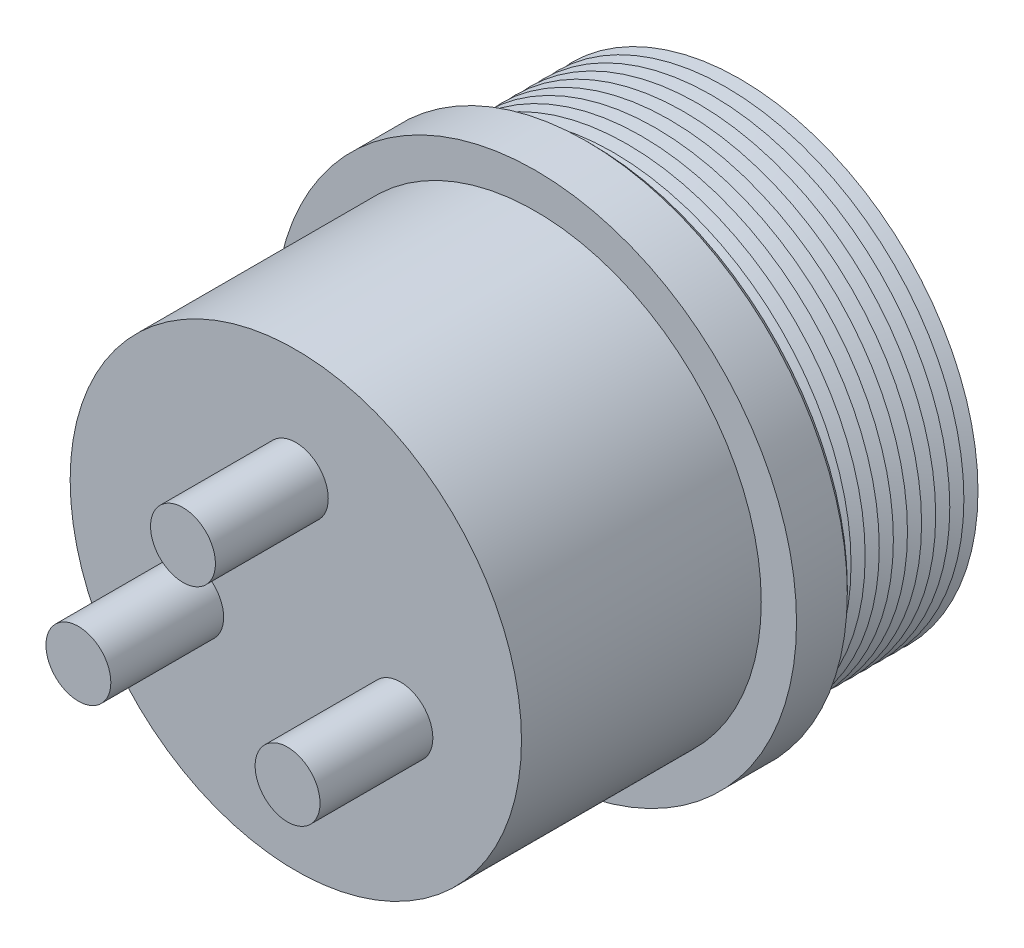
ISO-10303-21;
HEADER;
FILE_DESCRIPTION(('STEP AP214'),'2;1');
FILE_NAME('part.step','',(''),(''),'','','');
FILE_SCHEMA(('AUTOMOTIVE_DESIGN { 1 0 10303 214 1 1 1 1 }'));
ENDSEC;
DATA;
#1=APPLICATION_CONTEXT('core data for automotive mechanical design processes');
#2=APPLICATION_PROTOCOL_DEFINITION('international standard','automotive_design',2000,#1);
#3=PRODUCT_CONTEXT('',#1,'mechanical');
#4=PRODUCT('Part','Part','',(#3));
#5=PRODUCT_RELATED_PRODUCT_CATEGORY('part','',(#4));
#6=PRODUCT_DEFINITION_FORMATION('','',#4);
#7=PRODUCT_DEFINITION_CONTEXT('part definition',#1,'design');
#8=PRODUCT_DEFINITION('design','',#6,#7);
#9=PRODUCT_DEFINITION_SHAPE('','',#8);
#10=(LENGTH_UNIT() NAMED_UNIT(*) SI_UNIT(.MILLI.,.METRE.));
#11=(NAMED_UNIT(*) PLANE_ANGLE_UNIT() SI_UNIT($,.RADIAN.));
#12=(NAMED_UNIT(*) SI_UNIT($,.STERADIAN.) SOLID_ANGLE_UNIT());
#13=UNCERTAINTY_MEASURE_WITH_UNIT(LENGTH_MEASURE(1.E-05),#10,'distance_accuracy_value','');
#14=(GEOMETRIC_REPRESENTATION_CONTEXT(3) GLOBAL_UNCERTAINTY_ASSIGNED_CONTEXT((#13)) GLOBAL_UNIT_ASSIGNED_CONTEXT((#10,
#11,#12)) REPRESENTATION_CONTEXT('',''));
#15=CARTESIAN_POINT('',(0.,0.,0.));
#16=DIRECTION('',(0.,0.,1.));
#17=DIRECTION('',(1.,0.,0.));
#18=AXIS2_PLACEMENT_3D('',#15,#16,#17);
#19=CARTESIAN_POINT('',(0.,0.,0.75));
#20=DIRECTION('',(0.,0.,1.));
#21=DIRECTION('',(1.,0.,0.));
#22=AXIS2_PLACEMENT_3D('',#19,#20,#21);
#23=CONICAL_SURFACE('',#22,8.43301270189222,1.0471975511966);
#24=CARTESIAN_POINT('',(0.,0.,0.5));
#25=DIRECTION('',(0.,0.,-1.));
#26=DIRECTION('',(-1.,0.,0.));
#27=AXIS2_PLACEMENT_3D('',#24,#25,#26);
#28=CIRCLE('',#27,8.);
#29=CARTESIAN_POINT('',(-8.,0.,0.5));
#30=VERTEX_POINT('',#29);
#31=EDGE_CURVE('E112',#30,#30,#28,.T.);
#32=ORIENTED_EDGE('',*,*,#31,.F.);
#33=EDGE_LOOP('',(#32));
#34=FACE_BOUND('',#33,.T.);
#35=CARTESIAN_POINT('',(0.,0.,0.75));
#36=DIRECTION('',(0.,0.,-1.));
#37=DIRECTION('',(-1.,0.,0.));
#38=AXIS2_PLACEMENT_3D('',#35,#36,#37);
#39=CIRCLE('',#38,8.43301270189222);
#40=CARTESIAN_POINT('',(-8.43301270189222,0.,0.75));
#41=VERTEX_POINT('',#40);
#42=EDGE_CURVE('E115',#41,#41,#39,.T.);
#43=ORIENTED_EDGE('',*,*,#42,.T.);
#44=EDGE_LOOP('',(#43));
#45=FACE_BOUND('',#44,.T.);
#46=ADVANCED_FACE('F32',(#34,#45),#23,.T.);
#47=CARTESIAN_POINT('',(0.,0.,1.));
#48=DIRECTION('',(0.,0.,-1.));
#49=DIRECTION('',(-1.,0.,0.));
#50=AXIS2_PLACEMENT_3D('',#47,#48,#49);
#51=CONICAL_SURFACE('',#50,8.,1.0471975511966);
#52=ORIENTED_EDGE('',*,*,#42,.F.);
#53=EDGE_LOOP('',(#52));
#54=FACE_BOUND('',#53,.T.);
#55=CARTESIAN_POINT('',(0.,0.,1.));
#56=DIRECTION('',(0.,0.,-1.));
#57=DIRECTION('',(-1.,0.,0.));
#58=AXIS2_PLACEMENT_3D('',#55,#56,#57);
#59=CIRCLE('',#58,8.);
#60=CARTESIAN_POINT('',(-8.,0.,1.));
#61=VERTEX_POINT('',#60);
#62=EDGE_CURVE('E118',#61,#61,#59,.T.);
#63=ORIENTED_EDGE('',*,*,#62,.T.);
#64=EDGE_LOOP('',(#63));
#65=FACE_BOUND('',#64,.T.);
#66=ADVANCED_FACE('F192',(#54,#65),#51,.T.);
#67=CARTESIAN_POINT('',(0.,4.,0.));
#68=DIRECTION('',(0.,0.,1.));
#69=DIRECTION('',(1.,0.,0.));
#70=AXIS2_PLACEMENT_3D('',#67,#68,#69);
#71=PLANE('',#70);
#72=CARTESIAN_POINT('',(0.,4.,0.));
#73=DIRECTION('',(0.,0.,1.));
#74=DIRECTION('',(1.,0.,0.));
#75=AXIS2_PLACEMENT_3D('',#72,#73,#74);
#76=CIRCLE('',#75,0.15);
#77=CARTESIAN_POINT('',(0.15,4.,0.));
#78=VERTEX_POINT('',#77);
#79=EDGE_CURVE('E43',#78,#78,#76,.F.);
#80=ORIENTED_EDGE('',*,*,#79,.T.);
#81=EDGE_LOOP('',(#80));
#82=FACE_BOUND('',#81,.T.);
#83=ADVANCED_FACE('F198',(#82),#71,.F.);
#84=CARTESIAN_POINT('',(3.70809924354783,-1.5,0.));
#85=DIRECTION('',(0.,0.,1.));
#86=DIRECTION('',(1.,0.,0.));
#87=AXIS2_PLACEMENT_3D('',#84,#85,#86);
#88=PLANE('',#87);
#89=CARTESIAN_POINT('',(3.70809924354783,-1.5,0.));
#90=DIRECTION('',(0.,0.,1.));
#91=DIRECTION('',(1.,0.,0.));
#92=AXIS2_PLACEMENT_3D('',#89,#90,#91);
#93=CIRCLE('',#92,0.15);
#94=CARTESIAN_POINT('',(3.85809924354783,-1.5,0.));
#95=VERTEX_POINT('',#94);
#96=EDGE_CURVE('E52',#95,#95,#93,.F.);
#97=ORIENTED_EDGE('',*,*,#96,.T.);
#98=EDGE_LOOP('',(#97));
#99=FACE_BOUND('',#98,.T.);
#100=ADVANCED_FACE('F225',(#99),#88,.F.);
#101=CARTESIAN_POINT('',(-3.70809924354783,-1.5,0.));
#102=DIRECTION('',(0.,0.,1.));
#103=DIRECTION('',(1.,0.,0.));
#104=AXIS2_PLACEMENT_3D('',#101,#102,#103);
#105=PLANE('',#104);
#106=CARTESIAN_POINT('',(-3.70809924354783,-1.5,0.));
#107=DIRECTION('',(0.,0.,1.));
#108=DIRECTION('',(1.,0.,0.));
#109=AXIS2_PLACEMENT_3D('',#106,#107,#108);
#110=CIRCLE('',#109,0.15);
#111=CARTESIAN_POINT('',(-3.55809924354783,-1.5,0.));
#112=VERTEX_POINT('',#111);
#113=EDGE_CURVE('E58',#112,#112,#110,.F.);
#114=ORIENTED_EDGE('',*,*,#113,.T.);
#115=EDGE_LOOP('',(#114));
#116=FACE_BOUND('',#115,.T.);
#117=ADVANCED_FACE('F221',(#116),#105,.F.);
#118=CARTESIAN_POINT('',(0.,4.,1.));
#119=DIRECTION('',(0.,0.,1.));
#120=DIRECTION('',(1.,0.,0.));
#121=AXIS2_PLACEMENT_3D('',#118,#119,#120);
#122=DEGENERATE_TOROIDAL_SURFACE('',#121,0.15,1.,.T.);
#123=ORIENTED_EDGE('',*,*,#79,.F.);
#124=EDGE_LOOP('',(#123));
#125=FACE_BOUND('',#124,.T.);
#126=CARTESIAN_POINT('',(0.,4.,1.));
#127=DIRECTION('',(0.,0.,1.));
#128=DIRECTION('',(1.,0.,0.));
#129=AXIS2_PLACEMENT_3D('',#126,#127,#128);
#130=CIRCLE('',#129,1.15);
#131=CARTESIAN_POINT('',(1.15,4.,1.));
#132=VERTEX_POINT('',#131);
#133=EDGE_CURVE('E47',#132,#132,#130,.T.);
#134=ORIENTED_EDGE('',*,*,#133,.F.);
#135=EDGE_LOOP('',(#134));
#136=FACE_BOUND('',#135,.T.);
#137=ADVANCED_FACE('F224',(#125,#136),#122,.T.);
#138=CARTESIAN_POINT('',(3.70809924354783,-1.5,1.));
#139=DIRECTION('',(0.,0.,1.));
#140=DIRECTION('',(1.,0.,0.));
#141=AXIS2_PLACEMENT_3D('',#138,#139,#140);
#142=DEGENERATE_TOROIDAL_SURFACE('',#141,0.15,1.,.T.);
#143=ORIENTED_EDGE('',*,*,#96,.F.);
#144=EDGE_LOOP('',(#143));
#145=FACE_BOUND('',#144,.T.);
#146=CARTESIAN_POINT('',(3.70809924354783,-1.5,1.));
#147=DIRECTION('',(0.,0.,1.));
#148=DIRECTION('',(1.,0.,0.));
#149=AXIS2_PLACEMENT_3D('',#146,#147,#148);
#150=CIRCLE('',#149,1.15);
#151=CARTESIAN_POINT('',(4.85809924354783,-1.5,1.));
#152=VERTEX_POINT('',#151);
#153=EDGE_CURVE('E55',#152,#152,#150,.T.);
#154=ORIENTED_EDGE('',*,*,#153,.F.);
#155=EDGE_LOOP('',(#154));
#156=FACE_BOUND('',#155,.T.);
#157=ADVANCED_FACE('F286',(#145,#156),#142,.T.);
#158=CARTESIAN_POINT('',(-3.70809924354783,-1.5,1.));
#159=DIRECTION('',(0.,0.,1.));
#160=DIRECTION('',(1.,0.,0.));
#161=AXIS2_PLACEMENT_3D('',#158,#159,#160);
#162=DEGENERATE_TOROIDAL_SURFACE('',#161,0.15,1.,.T.);
#163=ORIENTED_EDGE('',*,*,#113,.F.);
#164=EDGE_LOOP('',(#163));
#165=FACE_BOUND('',#164,.T.);
#166=CARTESIAN_POINT('',(-3.70809924354783,-1.5,1.));
#167=DIRECTION('',(0.,0.,1.));
#168=DIRECTION('',(1.,0.,0.));
#169=AXIS2_PLACEMENT_3D('',#166,#167,#168);
#170=CIRCLE('',#169,1.15);
#171=CARTESIAN_POINT('',(-2.55809924354783,-1.5,1.));
#172=VERTEX_POINT('',#171);
#173=EDGE_CURVE('E61',#172,#172,#170,.T.);
#174=ORIENTED_EDGE('',*,*,#173,.F.);
#175=EDGE_LOOP('',(#174));
#176=FACE_BOUND('',#175,.T.);
#177=ADVANCED_FACE('F254',(#165,#176),#162,.T.);
#178=CARTESIAN_POINT('',(0.,4.,0.));
#179=DIRECTION('',(0.,0.,1.));
#180=DIRECTION('',(1.,0.,0.));
#181=AXIS2_PLACEMENT_3D('',#178,#179,#180);
#182=CYLINDRICAL_SURFACE('',#181,1.15);
#183=ORIENTED_EDGE('',*,*,#133,.T.);
#184=EDGE_LOOP('',(#183));
#185=FACE_BOUND('',#184,.T.);
#186=CARTESIAN_POINT('',(0.,4.,10.));
#187=DIRECTION('',(0.,0.,-1.));
#188=DIRECTION('',(-1.,0.,0.));
#189=AXIS2_PLACEMENT_3D('',#186,#187,#188);
#190=CIRCLE('',#189,1.15);
#191=CARTESIAN_POINT('',(-1.15,4.,10.));
#192=VERTEX_POINT('',#191);
#193=EDGE_CURVE('E73',#192,#192,#190,.T.);
#194=ORIENTED_EDGE('',*,*,#193,.T.);
#195=EDGE_LOOP('',(#194));
#196=FACE_BOUND('',#195,.T.);
#197=ADVANCED_FACE('F243',(#185,#196),#182,.T.);
#198=CARTESIAN_POINT('',(3.70809924354783,-1.5,0.));
#199=DIRECTION('',(0.,0.,1.));
#200=DIRECTION('',(1.,0.,0.));
#201=AXIS2_PLACEMENT_3D('',#198,#199,#200);
#202=CYLINDRICAL_SURFACE('',#201,1.15);
#203=ORIENTED_EDGE('',*,*,#153,.T.);
#204=EDGE_LOOP('',(#203));
#205=FACE_BOUND('',#204,.T.);
#206=CARTESIAN_POINT('',(3.70809924354783,-1.5,10.));
#207=DIRECTION('',(0.,0.,-1.));
#208=DIRECTION('',(-1.,0.,0.));
#209=AXIS2_PLACEMENT_3D('',#206,#207,#208);
#210=CIRCLE('',#209,1.15);
#211=CARTESIAN_POINT('',(2.55809924354783,-1.5,10.));
#212=VERTEX_POINT('',#211);
#213=EDGE_CURVE('E69',#212,#212,#210,.T.);
#214=ORIENTED_EDGE('',*,*,#213,.T.);
#215=EDGE_LOOP('',(#214));
#216=FACE_BOUND('',#215,.T.);
#217=ADVANCED_FACE('F231',(#205,#216),#202,.T.);
#218=CARTESIAN_POINT('',(-3.70809924354783,-1.5,0.));
#219=DIRECTION('',(0.,0.,1.));
#220=DIRECTION('',(1.,0.,0.));
#221=AXIS2_PLACEMENT_3D('',#218,#219,#220);
#222=CYLINDRICAL_SURFACE('',#221,1.15);
#223=ORIENTED_EDGE('',*,*,#173,.T.);
#224=EDGE_LOOP('',(#223));
#225=FACE_BOUND('',#224,.T.);
#226=CARTESIAN_POINT('',(-3.70809924354783,-1.5,10.));
#227=DIRECTION('',(0.,0.,-1.));
#228=DIRECTION('',(-1.,0.,0.));
#229=AXIS2_PLACEMENT_3D('',#226,#227,#228);
#230=CIRCLE('',#229,1.15);
#231=CARTESIAN_POINT('',(-4.85809924354783,-1.5,10.));
#232=VERTEX_POINT('',#231);
#233=EDGE_CURVE('E65',#232,#232,#230,.T.);
#234=ORIENTED_EDGE('',*,*,#233,.T.);
#235=EDGE_LOOP('',(#234));
#236=FACE_BOUND('',#235,.T.);
#237=ADVANCED_FACE('F227',(#225,#236),#222,.T.);
#238=CARTESIAN_POINT('',(0.,0.,10.));
#239=DIRECTION('',(0.,0.,-1.));
#240=DIRECTION('',(-1.,0.,0.));
#241=AXIS2_PLACEMENT_3D('',#238,#239,#240);
#242=PLANE('',#241);
#243=ORIENTED_EDGE('',*,*,#233,.F.);
#244=EDGE_LOOP('',(#243));
#245=FACE_BOUND('',#244,.T.);
#246=ORIENTED_EDGE('',*,*,#213,.F.);
#247=EDGE_LOOP('',(#246));
#248=FACE_BOUND('',#247,.T.);
#249=ORIENTED_EDGE('',*,*,#193,.F.);
#250=EDGE_LOOP('',(#249));
#251=FACE_BOUND('',#250,.T.);
#252=CARTESIAN_POINT('',(0.,0.,10.));
#253=DIRECTION('',(0.,0.,-1.));
#254=DIRECTION('',(-1.,0.,0.));
#255=AXIS2_PLACEMENT_3D('',#252,#253,#254);
#256=CIRCLE('',#255,7.00000000000001);
#257=CARTESIAN_POINT('',(-7.00000000000001,0.,10.));
#258=VERTEX_POINT('',#257);
#259=EDGE_CURVE('E88',#258,#258,#256,.T.);
#260=ORIENTED_EDGE('',*,*,#259,.T.);
#261=EDGE_LOOP('',(#260));
#262=FACE_BOUND('',#261,.T.);
#263=ADVANCED_FACE('F230',(#245,#248,#251,#262),#242,.T.);
#264=CARTESIAN_POINT('',(0.,0.,10.));
#265=DIRECTION('',(0.,0.,-1.));
#266=DIRECTION('',(-1.,0.,0.));
#267=AXIS2_PLACEMENT_3D('',#264,#265,#266);
#268=CYLINDRICAL_SURFACE('',#267,7.00000000000001);
#269=ORIENTED_EDGE('',*,*,#259,.F.);
#270=EDGE_LOOP('',(#269));
#271=FACE_BOUND('',#270,.T.);
#272=CARTESIAN_POINT('',(0.,0.,0.));
#273=DIRECTION('',(0.,0.,-1.));
#274=DIRECTION('',(-1.,0.,0.));
#275=AXIS2_PLACEMENT_3D('',#272,#273,#274);
#276=CIRCLE('',#275,7.00000000000001);
#277=CARTESIAN_POINT('',(-7.00000000000001,0.,0.));
#278=VERTEX_POINT('',#277);
#279=EDGE_CURVE('E89',#278,#278,#276,.T.);
#280=ORIENTED_EDGE('',*,*,#279,.T.);
#281=EDGE_LOOP('',(#280));
#282=FACE_BOUND('',#281,.T.);
#283=ADVANCED_FACE('F257',(#271,#282),#268,.F.);
#284=CARTESIAN_POINT('',(0.,0.,0.));
#285=DIRECTION('',(0.,0.,1.));
#286=DIRECTION('',(1.,0.,0.));
#287=AXIS2_PLACEMENT_3D('',#284,#285,#286);
#288=PLANE('',#287);
#289=ORIENTED_EDGE('',*,*,#279,.F.);
#290=EDGE_LOOP('',(#289));
#291=FACE_BOUND('',#290,.T.);
#292=CARTESIAN_POINT('',(0.,0.,0.));
#293=DIRECTION('',(0.,0.,1.));
#294=DIRECTION('',(1.,0.,0.));
#295=AXIS2_PLACEMENT_3D('',#292,#293,#294);
#296=CIRCLE('',#295,8.);
#297=CARTESIAN_POINT('',(8.,0.,0.));
#298=VERTEX_POINT('',#297);
#299=EDGE_CURVE('E77',#298,#298,#296,.T.);
#300=ORIENTED_EDGE('',*,*,#299,.F.);
#301=EDGE_LOOP('',(#300));
#302=FACE_BOUND('',#301,.T.);
#303=ADVANCED_FACE('F213',(#291,#302),#288,.F.);
#304=CARTESIAN_POINT('',(0.,0.,0.25));
#305=DIRECTION('',(0.,0.,1.));
#306=DIRECTION('',(1.,0.,0.));
#307=AXIS2_PLACEMENT_3D('',#304,#305,#306);
#308=CONICAL_SURFACE('',#307,8.43301270189222,1.0471975511966);
#309=ORIENTED_EDGE('',*,*,#299,.T.);
#310=EDGE_LOOP('',(#309));
#311=FACE_BOUND('',#310,.T.);
#312=CARTESIAN_POINT('',(0.,0.,0.25));
#313=DIRECTION('',(0.,0.,-1.));
#314=DIRECTION('',(-1.,0.,0.));
#315=AXIS2_PLACEMENT_3D('',#312,#313,#314);
#316=CIRCLE('',#315,8.43301270189222);
#317=CARTESIAN_POINT('',(-8.43301270189222,0.,0.25));
#318=VERTEX_POINT('',#317);
#319=EDGE_CURVE('E109',#318,#318,#316,.T.);
#320=ORIENTED_EDGE('',*,*,#319,.T.);
#321=EDGE_LOOP('',(#320));
#322=FACE_BOUND('',#321,.T.);
#323=ADVANCED_FACE('F209',(#311,#322),#308,.T.);
#324=CARTESIAN_POINT('',(0.,0.,0.5));
#325=DIRECTION('',(0.,0.,-1.));
#326=DIRECTION('',(-1.,0.,0.));
#327=AXIS2_PLACEMENT_3D('',#324,#325,#326);
#328=CONICAL_SURFACE('',#327,8.,1.0471975511966);
#329=ORIENTED_EDGE('',*,*,#319,.F.);
#330=EDGE_LOOP('',(#329));
#331=FACE_BOUND('',#330,.T.);
#332=ORIENTED_EDGE('',*,*,#31,.T.);
#333=EDGE_LOOP('',(#332));
#334=FACE_BOUND('',#333,.T.);
#335=ADVANCED_FACE('F205',(#331,#334),#328,.T.);
#336=CARTESIAN_POINT('',(0.,0.,1.25));
#337=DIRECTION('',(0.,0.,1.));
#338=DIRECTION('',(1.,0.,0.));
#339=AXIS2_PLACEMENT_3D('',#336,#337,#338);
#340=CONICAL_SURFACE('',#339,8.43301270189222,1.0471975511966);
#341=ORIENTED_EDGE('',*,*,#62,.F.);
#342=EDGE_LOOP('',(#341));
#343=FACE_BOUND('',#342,.T.);
#344=CARTESIAN_POINT('',(0.,0.,1.25));
#345=DIRECTION('',(0.,0.,-1.));
#346=DIRECTION('',(-1.,0.,0.));
#347=AXIS2_PLACEMENT_3D('',#344,#345,#346);
#348=CIRCLE('',#347,8.43301270189222);
#349=CARTESIAN_POINT('',(-8.43301270189222,0.,1.25));
#350=VERTEX_POINT('',#349);
#351=EDGE_CURVE('E121',#350,#350,#348,.T.);
#352=ORIENTED_EDGE('',*,*,#351,.T.);
#353=EDGE_LOOP('',(#352));
#354=FACE_BOUND('',#353,.T.);
#355=ADVANCED_FACE('F208',(#343,#354),#340,.T.);
#356=CARTESIAN_POINT('',(0.,0.,1.5));
#357=DIRECTION('',(0.,0.,-1.));
#358=DIRECTION('',(-1.,0.,0.));
#359=AXIS2_PLACEMENT_3D('',#356,#357,#358);
#360=CONICAL_SURFACE('',#359,8.,1.0471975511966);
#361=ORIENTED_EDGE('',*,*,#351,.F.);
#362=EDGE_LOOP('',(#361));
#363=FACE_BOUND('',#362,.T.);
#364=CARTESIAN_POINT('',(0.,0.,1.5));
#365=DIRECTION('',(0.,0.,-1.));
#366=DIRECTION('',(-1.,0.,0.));
#367=AXIS2_PLACEMENT_3D('',#364,#365,#366);
#368=CIRCLE('',#367,8.);
#369=CARTESIAN_POINT('',(-8.,0.,1.5));
#370=VERTEX_POINT('',#369);
#371=EDGE_CURVE('E124',#370,#370,#368,.T.);
#372=ORIENTED_EDGE('',*,*,#371,.T.);
#373=EDGE_LOOP('',(#372));
#374=FACE_BOUND('',#373,.T.);
#375=ADVANCED_FACE('F408',(#363,#374),#360,.T.);
#376=CARTESIAN_POINT('',(0.,0.,1.75));
#377=DIRECTION('',(0.,0.,1.));
#378=DIRECTION('',(1.,0.,0.));
#379=AXIS2_PLACEMENT_3D('',#376,#377,#378);
#380=CONICAL_SURFACE('',#379,8.43301270189222,1.0471975511966);
#381=ORIENTED_EDGE('',*,*,#371,.F.);
#382=EDGE_LOOP('',(#381));
#383=FACE_BOUND('',#382,.T.);
#384=CARTESIAN_POINT('',(0.,0.,1.75));
#385=DIRECTION('',(0.,0.,-1.));
#386=DIRECTION('',(-1.,0.,0.));
#387=AXIS2_PLACEMENT_3D('',#384,#385,#386);
#388=CIRCLE('',#387,8.43301270189222);
#389=CARTESIAN_POINT('',(-8.43301270189222,0.,1.75));
#390=VERTEX_POINT('',#389);
#391=EDGE_CURVE('E127',#390,#390,#388,.T.);
#392=ORIENTED_EDGE('',*,*,#391,.T.);
#393=EDGE_LOOP('',(#392));
#394=FACE_BOUND('',#393,.T.);
#395=ADVANCED_FACE('F417',(#383,#394),#380,.T.);
#396=CARTESIAN_POINT('',(0.,0.,2.));
#397=DIRECTION('',(0.,0.,-1.));
#398=DIRECTION('',(-1.,0.,0.));
#399=AXIS2_PLACEMENT_3D('',#396,#397,#398);
#400=CONICAL_SURFACE('',#399,8.,1.0471975511966);
#401=ORIENTED_EDGE('',*,*,#391,.F.);
#402=EDGE_LOOP('',(#401));
#403=FACE_BOUND('',#402,.T.);
#404=CARTESIAN_POINT('',(0.,0.,2.));
#405=DIRECTION('',(0.,0.,-1.));
#406=DIRECTION('',(-1.,0.,0.));
#407=AXIS2_PLACEMENT_3D('',#404,#405,#406);
#408=CIRCLE('',#407,8.);
#409=CARTESIAN_POINT('',(-8.,0.,2.));
#410=VERTEX_POINT('',#409);
#411=EDGE_CURVE('E130',#410,#410,#408,.T.);
#412=ORIENTED_EDGE('',*,*,#411,.T.);
#413=EDGE_LOOP('',(#412));
#414=FACE_BOUND('',#413,.T.);
#415=ADVANCED_FACE('F427',(#403,#414),#400,.T.);
#416=CARTESIAN_POINT('',(0.,0.,2.25));
#417=DIRECTION('',(0.,0.,1.));
#418=DIRECTION('',(1.,0.,0.));
#419=AXIS2_PLACEMENT_3D('',#416,#417,#418);
#420=CONICAL_SURFACE('',#419,8.43301270189222,1.0471975511966);
#421=ORIENTED_EDGE('',*,*,#411,.F.);
#422=EDGE_LOOP('',(#421));
#423=FACE_BOUND('',#422,.T.);
#424=CARTESIAN_POINT('',(0.,0.,2.25));
#425=DIRECTION('',(0.,0.,-1.));
#426=DIRECTION('',(-1.,0.,0.));
#427=AXIS2_PLACEMENT_3D('',#424,#425,#426);
#428=CIRCLE('',#427,8.43301270189222);
#429=CARTESIAN_POINT('',(-8.43301270189222,0.,2.25));
#430=VERTEX_POINT('',#429);
#431=EDGE_CURVE('E133',#430,#430,#428,.T.);
#432=ORIENTED_EDGE('',*,*,#431,.T.);
#433=EDGE_LOOP('',(#432));
#434=FACE_BOUND('',#433,.T.);
#435=ADVANCED_FACE('F437',(#423,#434),#420,.T.);
#436=CARTESIAN_POINT('',(0.,0.,2.5));
#437=DIRECTION('',(0.,0.,-1.));
#438=DIRECTION('',(-1.,0.,0.));
#439=AXIS2_PLACEMENT_3D('',#436,#437,#438);
#440=CONICAL_SURFACE('',#439,8.,1.0471975511966);
#441=ORIENTED_EDGE('',*,*,#431,.F.);
#442=EDGE_LOOP('',(#441));
#443=FACE_BOUND('',#442,.T.);
#444=CARTESIAN_POINT('',(0.,0.,2.5));
#445=DIRECTION('',(0.,0.,-1.));
#446=DIRECTION('',(-1.,0.,0.));
#447=AXIS2_PLACEMENT_3D('',#444,#445,#446);
#448=CIRCLE('',#447,8.);
#449=CARTESIAN_POINT('',(-8.,0.,2.5));
#450=VERTEX_POINT('',#449);
#451=EDGE_CURVE('E136',#450,#450,#448,.T.);
#452=ORIENTED_EDGE('',*,*,#451,.T.);
#453=EDGE_LOOP('',(#452));
#454=FACE_BOUND('',#453,.T.);
#455=ADVANCED_FACE('F447',(#443,#454),#440,.T.);
#456=CARTESIAN_POINT('',(0.,0.,2.75));
#457=DIRECTION('',(0.,0.,1.));
#458=DIRECTION('',(1.,0.,0.));
#459=AXIS2_PLACEMENT_3D('',#456,#457,#458);
#460=CONICAL_SURFACE('',#459,8.43301270189222,1.0471975511966);
#461=ORIENTED_EDGE('',*,*,#451,.F.);
#462=EDGE_LOOP('',(#461));
#463=FACE_BOUND('',#462,.T.);
#464=CARTESIAN_POINT('',(0.,0.,2.75));
#465=DIRECTION('',(0.,0.,-1.));
#466=DIRECTION('',(-1.,0.,0.));
#467=AXIS2_PLACEMENT_3D('',#464,#465,#466);
#468=CIRCLE('',#467,8.43301270189222);
#469=CARTESIAN_POINT('',(-8.43301270189222,0.,2.75));
#470=VERTEX_POINT('',#469);
#471=EDGE_CURVE('E139',#470,#470,#468,.T.);
#472=ORIENTED_EDGE('',*,*,#471,.T.);
#473=EDGE_LOOP('',(#472));
#474=FACE_BOUND('',#473,.T.);
#475=ADVANCED_FACE('F457',(#463,#474),#460,.T.);
#476=CARTESIAN_POINT('',(0.,0.,3.));
#477=DIRECTION('',(0.,0.,-1.));
#478=DIRECTION('',(-1.,0.,0.));
#479=AXIS2_PLACEMENT_3D('',#476,#477,#478);
#480=CONICAL_SURFACE('',#479,8.,1.0471975511966);
#481=ORIENTED_EDGE('',*,*,#471,.F.);
#482=EDGE_LOOP('',(#481));
#483=FACE_BOUND('',#482,.T.);
#484=CARTESIAN_POINT('',(0.,0.,3.));
#485=DIRECTION('',(0.,0.,-1.));
#486=DIRECTION('',(-1.,0.,0.));
#487=AXIS2_PLACEMENT_3D('',#484,#485,#486);
#488=CIRCLE('',#487,8.);
#489=CARTESIAN_POINT('',(-8.,0.,3.));
#490=VERTEX_POINT('',#489);
#491=EDGE_CURVE('E142',#490,#490,#488,.T.);
#492=ORIENTED_EDGE('',*,*,#491,.T.);
#493=EDGE_LOOP('',(#492));
#494=FACE_BOUND('',#493,.T.);
#495=ADVANCED_FACE('F467',(#483,#494),#480,.T.);
#496=CARTESIAN_POINT('',(0.,0.,3.25));
#497=DIRECTION('',(0.,0.,1.));
#498=DIRECTION('',(1.,0.,0.));
#499=AXIS2_PLACEMENT_3D('',#496,#497,#498);
#500=CONICAL_SURFACE('',#499,8.43301270189222,1.0471975511966);
#501=ORIENTED_EDGE('',*,*,#491,.F.);
#502=EDGE_LOOP('',(#501));
#503=FACE_BOUND('',#502,.T.);
#504=CARTESIAN_POINT('',(0.,0.,3.25));
#505=DIRECTION('',(0.,0.,-1.));
#506=DIRECTION('',(-1.,0.,0.));
#507=AXIS2_PLACEMENT_3D('',#504,#505,#506);
#508=CIRCLE('',#507,8.43301270189222);
#509=CARTESIAN_POINT('',(-8.43301270189222,0.,3.25));
#510=VERTEX_POINT('',#509);
#511=EDGE_CURVE('E145',#510,#510,#508,.T.);
#512=ORIENTED_EDGE('',*,*,#511,.T.);
#513=EDGE_LOOP('',(#512));
#514=FACE_BOUND('',#513,.T.);
#515=ADVANCED_FACE('F477',(#503,#514),#500,.T.);
#516=CARTESIAN_POINT('',(0.,0.,3.5));
#517=DIRECTION('',(0.,0.,-1.));
#518=DIRECTION('',(-1.,0.,0.));
#519=AXIS2_PLACEMENT_3D('',#516,#517,#518);
#520=CONICAL_SURFACE('',#519,8.,1.0471975511966);
#521=ORIENTED_EDGE('',*,*,#511,.F.);
#522=EDGE_LOOP('',(#521));
#523=FACE_BOUND('',#522,.T.);
#524=CARTESIAN_POINT('',(0.,0.,3.5));
#525=DIRECTION('',(0.,0.,-1.));
#526=DIRECTION('',(-1.,0.,0.));
#527=AXIS2_PLACEMENT_3D('',#524,#525,#526);
#528=CIRCLE('',#527,8.);
#529=CARTESIAN_POINT('',(-8.,0.,3.5));
#530=VERTEX_POINT('',#529);
#531=EDGE_CURVE('E148',#530,#530,#528,.T.);
#532=ORIENTED_EDGE('',*,*,#531,.T.);
#533=EDGE_LOOP('',(#532));
#534=FACE_BOUND('',#533,.T.);
#535=ADVANCED_FACE('F487',(#523,#534),#520,.T.);
#536=CARTESIAN_POINT('',(0.,0.,3.75));
#537=DIRECTION('',(0.,0.,1.));
#538=DIRECTION('',(1.,0.,0.));
#539=AXIS2_PLACEMENT_3D('',#536,#537,#538);
#540=CONICAL_SURFACE('',#539,8.43301270189222,1.0471975511966);
#541=ORIENTED_EDGE('',*,*,#531,.F.);
#542=EDGE_LOOP('',(#541));
#543=FACE_BOUND('',#542,.T.);
#544=CARTESIAN_POINT('',(0.,0.,3.75));
#545=DIRECTION('',(0.,0.,-1.));
#546=DIRECTION('',(-1.,0.,0.));
#547=AXIS2_PLACEMENT_3D('',#544,#545,#546);
#548=CIRCLE('',#547,8.43301270189222);
#549=CARTESIAN_POINT('',(-8.43301270189222,0.,3.75));
#550=VERTEX_POINT('',#549);
#551=EDGE_CURVE('E151',#550,#550,#548,.T.);
#552=ORIENTED_EDGE('',*,*,#551,.T.);
#553=EDGE_LOOP('',(#552));
#554=FACE_BOUND('',#553,.T.);
#555=ADVANCED_FACE('F497',(#543,#554),#540,.T.);
#556=CARTESIAN_POINT('',(0.,0.,4.));
#557=DIRECTION('',(0.,0.,-1.));
#558=DIRECTION('',(-1.,0.,0.));
#559=AXIS2_PLACEMENT_3D('',#556,#557,#558);
#560=CONICAL_SURFACE('',#559,8.,1.0471975511966);
#561=ORIENTED_EDGE('',*,*,#551,.F.);
#562=EDGE_LOOP('',(#561));
#563=FACE_BOUND('',#562,.T.);
#564=CARTESIAN_POINT('',(0.,0.,4.));
#565=DIRECTION('',(0.,0.,-1.));
#566=DIRECTION('',(-1.,0.,0.));
#567=AXIS2_PLACEMENT_3D('',#564,#565,#566);
#568=CIRCLE('',#567,8.);
#569=CARTESIAN_POINT('',(-8.,0.,4.));
#570=VERTEX_POINT('',#569);
#571=EDGE_CURVE('E154',#570,#570,#568,.T.);
#572=ORIENTED_EDGE('',*,*,#571,.T.);
#573=EDGE_LOOP('',(#572));
#574=FACE_BOUND('',#573,.T.);
#575=ADVANCED_FACE('F507',(#563,#574),#560,.T.);
#576=CARTESIAN_POINT('',(0.,0.,4.25));
#577=DIRECTION('',(0.,0.,1.));
#578=DIRECTION('',(1.,0.,0.));
#579=AXIS2_PLACEMENT_3D('',#576,#577,#578);
#580=CONICAL_SURFACE('',#579,8.43301270189222,1.0471975511966);
#581=ORIENTED_EDGE('',*,*,#571,.F.);
#582=EDGE_LOOP('',(#581));
#583=FACE_BOUND('',#582,.T.);
#584=CARTESIAN_POINT('',(0.,0.,4.25));
#585=DIRECTION('',(0.,0.,-1.));
#586=DIRECTION('',(-1.,0.,0.));
#587=AXIS2_PLACEMENT_3D('',#584,#585,#586);
#588=CIRCLE('',#587,8.43301270189222);
#589=CARTESIAN_POINT('',(-8.43301270189222,0.,4.25));
#590=VERTEX_POINT('',#589);
#591=EDGE_CURVE('E157',#590,#590,#588,.T.);
#592=ORIENTED_EDGE('',*,*,#591,.T.);
#593=EDGE_LOOP('',(#592));
#594=FACE_BOUND('',#593,.T.);
#595=ADVANCED_FACE('F517',(#583,#594),#580,.T.);
#596=CARTESIAN_POINT('',(0.,0.,4.5));
#597=DIRECTION('',(0.,0.,-1.));
#598=DIRECTION('',(-1.,0.,0.));
#599=AXIS2_PLACEMENT_3D('',#596,#597,#598);
#600=CONICAL_SURFACE('',#599,8.,1.0471975511966);
#601=ORIENTED_EDGE('',*,*,#591,.F.);
#602=EDGE_LOOP('',(#601));
#603=FACE_BOUND('',#602,.T.);
#604=CARTESIAN_POINT('',(0.,0.,4.5));
#605=DIRECTION('',(0.,0.,-1.));
#606=DIRECTION('',(-1.,0.,0.));
#607=AXIS2_PLACEMENT_3D('',#604,#605,#606);
#608=CIRCLE('',#607,8.);
#609=CARTESIAN_POINT('',(-8.,0.,4.5));
#610=VERTEX_POINT('',#609);
#611=EDGE_CURVE('E160',#610,#610,#608,.T.);
#612=ORIENTED_EDGE('',*,*,#611,.T.);
#613=EDGE_LOOP('',(#612));
#614=FACE_BOUND('',#613,.T.);
#615=ADVANCED_FACE('F527',(#603,#614),#600,.T.);
#616=CARTESIAN_POINT('',(0.,0.,4.75));
#617=DIRECTION('',(0.,0.,1.));
#618=DIRECTION('',(1.,0.,0.));
#619=AXIS2_PLACEMENT_3D('',#616,#617,#618);
#620=CONICAL_SURFACE('',#619,8.43301270189222,1.0471975511966);
#621=ORIENTED_EDGE('',*,*,#611,.F.);
#622=EDGE_LOOP('',(#621));
#623=FACE_BOUND('',#622,.T.);
#624=CARTESIAN_POINT('',(0.,0.,4.75));
#625=DIRECTION('',(0.,0.,-1.));
#626=DIRECTION('',(-1.,0.,0.));
#627=AXIS2_PLACEMENT_3D('',#624,#625,#626);
#628=CIRCLE('',#627,8.43301270189222);
#629=CARTESIAN_POINT('',(-8.43301270189222,0.,4.75));
#630=VERTEX_POINT('',#629);
#631=EDGE_CURVE('E163',#630,#630,#628,.T.);
#632=ORIENTED_EDGE('',*,*,#631,.T.);
#633=EDGE_LOOP('',(#632));
#634=FACE_BOUND('',#633,.T.);
#635=ADVANCED_FACE('F537',(#623,#634),#620,.T.);
#636=CARTESIAN_POINT('',(0.,0.,5.));
#637=DIRECTION('',(0.,0.,-1.));
#638=DIRECTION('',(-1.,0.,0.));
#639=AXIS2_PLACEMENT_3D('',#636,#637,#638);
#640=CONICAL_SURFACE('',#639,8.,1.0471975511966);
#641=ORIENTED_EDGE('',*,*,#631,.F.);
#642=EDGE_LOOP('',(#641));
#643=FACE_BOUND('',#642,.T.);
#644=CARTESIAN_POINT('',(0.,0.,5.));
#645=DIRECTION('',(0.,0.,-1.));
#646=DIRECTION('',(-1.,0.,0.));
#647=AXIS2_PLACEMENT_3D('',#644,#645,#646);
#648=CIRCLE('',#647,8.);
#649=CARTESIAN_POINT('',(-8.,0.,5.));
#650=VERTEX_POINT('',#649);
#651=EDGE_CURVE('E166',#650,#650,#648,.T.);
#652=ORIENTED_EDGE('',*,*,#651,.T.);
#653=EDGE_LOOP('',(#652));
#654=FACE_BOUND('',#653,.T.);
#655=ADVANCED_FACE('F547',(#643,#654),#640,.T.);
#656=CARTESIAN_POINT('',(0.,0.,5.25));
#657=DIRECTION('',(0.,0.,1.));
#658=DIRECTION('',(1.,0.,0.));
#659=AXIS2_PLACEMENT_3D('',#656,#657,#658);
#660=CONICAL_SURFACE('',#659,8.43301270189222,1.0471975511966);
#661=ORIENTED_EDGE('',*,*,#651,.F.);
#662=EDGE_LOOP('',(#661));
#663=FACE_BOUND('',#662,.T.);
#664=CARTESIAN_POINT('',(0.,0.,5.25));
#665=DIRECTION('',(0.,0.,-1.));
#666=DIRECTION('',(-1.,0.,0.));
#667=AXIS2_PLACEMENT_3D('',#664,#665,#666);
#668=CIRCLE('',#667,8.43301270189222);
#669=CARTESIAN_POINT('',(-8.43301270189222,0.,5.25));
#670=VERTEX_POINT('',#669);
#671=EDGE_CURVE('E169',#670,#670,#668,.T.);
#672=ORIENTED_EDGE('',*,*,#671,.T.);
#673=EDGE_LOOP('',(#672));
#674=FACE_BOUND('',#673,.T.);
#675=ADVANCED_FACE('F557',(#663,#674),#660,.T.);
#676=CARTESIAN_POINT('',(0.,0.,5.5));
#677=DIRECTION('',(0.,0.,-1.));
#678=DIRECTION('',(-1.,0.,0.));
#679=AXIS2_PLACEMENT_3D('',#676,#677,#678);
#680=CONICAL_SURFACE('',#679,8.,1.0471975511966);
#681=ORIENTED_EDGE('',*,*,#671,.F.);
#682=EDGE_LOOP('',(#681));
#683=FACE_BOUND('',#682,.T.);
#684=CARTESIAN_POINT('',(0.,0.,5.5));
#685=DIRECTION('',(0.,0.,-1.));
#686=DIRECTION('',(-1.,0.,0.));
#687=AXIS2_PLACEMENT_3D('',#684,#685,#686);
#688=CIRCLE('',#687,8.);
#689=CARTESIAN_POINT('',(-8.,0.,5.5));
#690=VERTEX_POINT('',#689);
#691=EDGE_CURVE('E172',#690,#690,#688,.T.);
#692=ORIENTED_EDGE('',*,*,#691,.T.);
#693=EDGE_LOOP('',(#692));
#694=FACE_BOUND('',#693,.T.);
#695=ADVANCED_FACE('F176',(#683,#694),#680,.T.);
#696=CARTESIAN_POINT('',(0.,4.,20.));
#697=DIRECTION('',(0.,0.,1.));
#698=DIRECTION('',(1.,0.,0.));
#699=AXIS2_PLACEMENT_3D('',#696,#697,#698);
#700=PLANE('',#699);
#701=CARTESIAN_POINT('',(0.,4.,20.));
#702=DIRECTION('',(0.,0.,1.));
#703=DIRECTION('',(1.,0.,0.));
#704=AXIS2_PLACEMENT_3D('',#701,#702,#703);
#705=CIRCLE('',#704,1.15);
#706=CARTESIAN_POINT('',(1.15,4.,20.));
#707=VERTEX_POINT('',#706);
#708=EDGE_CURVE('E92',#707,#707,#705,.T.);
#709=ORIENTED_EDGE('',*,*,#708,.T.);
#710=EDGE_LOOP('',(#709));
#711=FACE_BOUND('',#710,.T.);
#712=ADVANCED_FACE('F236',(#711),#700,.T.);
#713=CARTESIAN_POINT('',(3.70809924354783,-1.5,20.));
#714=DIRECTION('',(0.,0.,1.));
#715=DIRECTION('',(1.,0.,0.));
#716=AXIS2_PLACEMENT_3D('',#713,#714,#715);
#717=PLANE('',#716);
#718=CARTESIAN_POINT('',(3.70809924354783,-1.5,20.));
#719=DIRECTION('',(0.,0.,1.));
#720=DIRECTION('',(1.,0.,0.));
#721=AXIS2_PLACEMENT_3D('',#718,#719,#720);
#722=CIRCLE('',#721,1.15);
#723=CARTESIAN_POINT('',(4.85809924354783,-1.5,20.));
#724=VERTEX_POINT('',#723);
#725=EDGE_CURVE('E99',#724,#724,#722,.T.);
#726=ORIENTED_EDGE('',*,*,#725,.T.);
#727=EDGE_LOOP('',(#726));
#728=FACE_BOUND('',#727,.T.);
#729=ADVANCED_FACE('F219',(#728),#717,.T.);
#730=CARTESIAN_POINT('',(-3.70809924354783,-1.5,20.));
#731=DIRECTION('',(0.,0.,1.));
#732=DIRECTION('',(1.,0.,0.));
#733=AXIS2_PLACEMENT_3D('',#730,#731,#732);
#734=PLANE('',#733);
#735=CARTESIAN_POINT('',(-3.70809924354783,-1.5,20.));
#736=DIRECTION('',(0.,0.,1.));
#737=DIRECTION('',(1.,0.,0.));
#738=AXIS2_PLACEMENT_3D('',#735,#736,#737);
#739=CIRCLE('',#738,1.15);
#740=CARTESIAN_POINT('',(-2.55809924354783,-1.5,20.));
#741=VERTEX_POINT('',#740);
#742=EDGE_CURVE('E104',#741,#741,#739,.T.);
#743=ORIENTED_EDGE('',*,*,#742,.T.);
#744=EDGE_LOOP('',(#743));
#745=FACE_BOUND('',#744,.T.);
#746=ADVANCED_FACE('F215',(#745),#734,.T.);
#747=CARTESIAN_POINT('',(0.,4.,16.));
#748=DIRECTION('',(0.,0.,1.));
#749=DIRECTION('',(1.,0.,0.));
#750=AXIS2_PLACEMENT_3D('',#747,#748,#749);
#751=CIRCLE('',#750,1.15);
#752=CARTESIAN_POINT('',(1.15,4.,16.));
#753=VERTEX_POINT('',#752);
#754=EDGE_CURVE('E72',#753,#753,#751,.T.);
#755=ORIENTED_EDGE('',*,*,#754,.T.);
#756=EDGE_LOOP('',(#755));
#757=FACE_BOUND('',#756,.T.);
#758=ORIENTED_EDGE('',*,*,#708,.F.);
#759=EDGE_LOOP('',(#758));
#760=FACE_BOUND('',#759,.T.);
#761=ADVANCED_FACE('F218',(#757,#760),#182,.T.);
#762=CARTESIAN_POINT('',(3.70809924354783,-1.5,16.));
#763=DIRECTION('',(0.,0.,1.));
#764=DIRECTION('',(1.,0.,0.));
#765=AXIS2_PLACEMENT_3D('',#762,#763,#764);
#766=CIRCLE('',#765,1.15);
#767=CARTESIAN_POINT('',(4.85809924354783,-1.5,16.));
#768=VERTEX_POINT('',#767);
#769=EDGE_CURVE('E68',#768,#768,#766,.T.);
#770=ORIENTED_EDGE('',*,*,#769,.T.);
#771=EDGE_LOOP('',(#770));
#772=FACE_BOUND('',#771,.T.);
#773=ORIENTED_EDGE('',*,*,#725,.F.);
#774=EDGE_LOOP('',(#773));
#775=FACE_BOUND('',#774,.T.);
#776=ADVANCED_FACE('F245',(#772,#775),#202,.T.);
#777=CARTESIAN_POINT('',(-3.70809924354783,-1.5,16.));
#778=DIRECTION('',(0.,0.,1.));
#779=DIRECTION('',(1.,0.,0.));
#780=AXIS2_PLACEMENT_3D('',#777,#778,#779);
#781=CIRCLE('',#780,1.15);
#782=CARTESIAN_POINT('',(-2.55809924354783,-1.5,16.));
#783=VERTEX_POINT('',#782);
#784=EDGE_CURVE('E64',#783,#783,#781,.T.);
#785=ORIENTED_EDGE('',*,*,#784,.T.);
#786=EDGE_LOOP('',(#785));
#787=FACE_BOUND('',#786,.T.);
#788=ORIENTED_EDGE('',*,*,#742,.F.);
#789=EDGE_LOOP('',(#788));
#790=FACE_BOUND('',#789,.T.);
#791=ADVANCED_FACE('F233',(#787,#790),#222,.T.);
#792=CARTESIAN_POINT('',(0.,0.,16.));
#793=DIRECTION('',(0.,0.,1.));
#794=DIRECTION('',(1.,0.,0.));
#795=AXIS2_PLACEMENT_3D('',#792,#793,#794);
#796=PLANE('',#795);
#797=ORIENTED_EDGE('',*,*,#784,.F.);
#798=EDGE_LOOP('',(#797));
#799=FACE_BOUND('',#798,.T.);
#800=ORIENTED_EDGE('',*,*,#769,.F.);
#801=EDGE_LOOP('',(#800));
#802=FACE_BOUND('',#801,.T.);
#803=ORIENTED_EDGE('',*,*,#754,.F.);
#804=EDGE_LOOP('',(#803));
#805=FACE_BOUND('',#804,.T.);
#806=CARTESIAN_POINT('',(0.,0.,16.));
#807=DIRECTION('',(0.,0.,1.));
#808=DIRECTION('',(1.,0.,0.));
#809=AXIS2_PLACEMENT_3D('',#806,#807,#808);
#810=CIRCLE('',#809,8.);
#811=CARTESIAN_POINT('',(8.,0.,16.));
#812=VERTEX_POINT('',#811);
#813=EDGE_CURVE('E76',#812,#812,#810,.T.);
#814=ORIENTED_EDGE('',*,*,#813,.T.);
#815=EDGE_LOOP('',(#814));
#816=FACE_BOUND('',#815,.T.);
#817=ADVANCED_FACE('F279',(#799,#802,#805,#816),#796,.T.);
#818=CARTESIAN_POINT('',(0.,0.,16.));
#819=DIRECTION('',(0.,0.,-1.));
#820=DIRECTION('',(-1.,0.,0.));
#821=AXIS2_PLACEMENT_3D('',#818,#819,#820);
#822=CYLINDRICAL_SURFACE('',#821,8.);
#823=CARTESIAN_POINT('',(0.,0.,7.5));
#824=DIRECTION('',(0.,0.,1.));
#825=DIRECTION('',(1.,0.,0.));
#826=AXIS2_PLACEMENT_3D('',#823,#824,#825);
#827=CIRCLE('',#826,8.);
#828=CARTESIAN_POINT('',(8.,0.,7.5));
#829=VERTEX_POINT('',#828);
#830=EDGE_CURVE('E85',#829,#829,#827,.T.);
#831=ORIENTED_EDGE('',*,*,#830,.T.);
#832=EDGE_LOOP('',(#831));
#833=FACE_BOUND('',#832,.T.);
#834=ORIENTED_EDGE('',*,*,#813,.F.);
#835=EDGE_LOOP('',(#834));
#836=FACE_BOUND('',#835,.T.);
#837=ADVANCED_FACE('F280',(#833,#836),#822,.T.);
#838=CARTESIAN_POINT('',(0.,0.,7.5));
#839=DIRECTION('',(0.,0.,1.));
#840=DIRECTION('',(1.,0.,0.));
#841=AXIS2_PLACEMENT_3D('',#838,#839,#840);
#842=PLANE('',#841);
#843=ORIENTED_EDGE('',*,*,#830,.F.);
#844=EDGE_LOOP('',(#843));
#845=FACE_BOUND('',#844,.T.);
#846=CARTESIAN_POINT('',(0.,0.,7.5));
#847=DIRECTION('',(0.,0.,1.));
#848=DIRECTION('',(1.,0.,0.));
#849=AXIS2_PLACEMENT_3D('',#846,#847,#848);
#850=CIRCLE('',#849,9.25);
#851=CARTESIAN_POINT('',(9.25,0.,7.5));
#852=VERTEX_POINT('',#851);
#853=EDGE_CURVE('E80',#852,#852,#850,.T.);
#854=ORIENTED_EDGE('',*,*,#853,.T.);
#855=EDGE_LOOP('',(#854));
#856=FACE_BOUND('',#855,.T.);
#857=ADVANCED_FACE('F187',(#845,#856),#842,.T.);
#858=CARTESIAN_POINT('',(0.,0.,5.5));
#859=DIRECTION('',(0.,0.,1.));
#860=DIRECTION('',(1.,0.,0.));
#861=AXIS2_PLACEMENT_3D('',#858,#859,#860);
#862=CYLINDRICAL_SURFACE('',#861,9.25);
#863=CARTESIAN_POINT('',(0.,0.,5.7));
#864=DIRECTION('',(0.,0.,1.));
#865=DIRECTION('',(1.,0.,0.));
#866=AXIS2_PLACEMENT_3D('',#863,#864,#865);
#867=CIRCLE('',#866,9.25);
#868=CARTESIAN_POINT('',(9.25,0.,5.7));
#869=VERTEX_POINT('',#868);
#870=EDGE_CURVE('E39',#869,#869,#867,.T.);
#871=ORIENTED_EDGE('',*,*,#870,.T.);
#872=EDGE_LOOP('',(#871));
#873=FACE_BOUND('',#872,.T.);
#874=ORIENTED_EDGE('',*,*,#853,.F.);
#875=EDGE_LOOP('',(#874));
#876=FACE_BOUND('',#875,.T.);
#877=ADVANCED_FACE('F180',(#873,#876),#862,.T.);
#878=CARTESIAN_POINT('',(0.,0.,5.5));
#879=DIRECTION('',(0.,0.,1.));
#880=DIRECTION('',(1.,0.,0.));
#881=AXIS2_PLACEMENT_3D('',#878,#879,#880);
#882=PLANE('',#881);
#883=CARTESIAN_POINT('',(0.,0.,5.5));
#884=DIRECTION('',(0.,0.,1.));
#885=DIRECTION('',(1.,0.,0.));
#886=AXIS2_PLACEMENT_3D('',#883,#884,#885);
#887=CIRCLE('',#886,9.05);
#888=CARTESIAN_POINT('',(9.05,0.,5.5));
#889=VERTEX_POINT('',#888);
#890=EDGE_CURVE('E10',#889,#889,#887,.F.);
#891=ORIENTED_EDGE('',*,*,#890,.T.);
#892=EDGE_LOOP('',(#891));
#893=FACE_BOUND('',#892,.T.);
#894=ORIENTED_EDGE('',*,*,#691,.F.);
#895=EDGE_LOOP('',(#894));
#896=FACE_BOUND('',#895,.T.);
#897=ADVANCED_FACE('F178',(#893,#896),#882,.F.);
#898=CARTESIAN_POINT('',(0.,0.,5.7));
#899=DIRECTION('',(0.,0.,1.));
#900=DIRECTION('',(1.,0.,0.));
#901=AXIS2_PLACEMENT_3D('',#898,#899,#900);
#902=CONICAL_SURFACE('',#901,9.25,0.785398163397457);
#903=ORIENTED_EDGE('',*,*,#890,.F.);
#904=EDGE_LOOP('',(#903));
#905=FACE_BOUND('',#904,.T.);
#906=ORIENTED_EDGE('',*,*,#870,.F.);
#907=EDGE_LOOP('',(#906));
#908=FACE_BOUND('',#907,.T.);
#909=ADVANCED_FACE('F34',(#905,#908),#902,.T.);
#910=CLOSED_SHELL('',(#46,#66,#83,#100,#117,#137,#157,#177,#197,#217,#237,#263,#283,#303,#323,
#335,#355,#375,#395,#415,#435,#455,#475,#495,#515,#535,#555,#575,#595,#615,#635,#655,#675,#695,
#712,#729,#746,#761,#776,#791,#817,#837,#857,#877,#897,#909));
#911=MANIFOLD_SOLID_BREP('B2',#910);
#912=ADVANCED_BREP_SHAPE_REPRESENTATION('',(#18,#911),#14);
#913=SHAPE_DEFINITION_REPRESENTATION(#9,#912);
ENDSEC;
END-ISO-10303-21;
